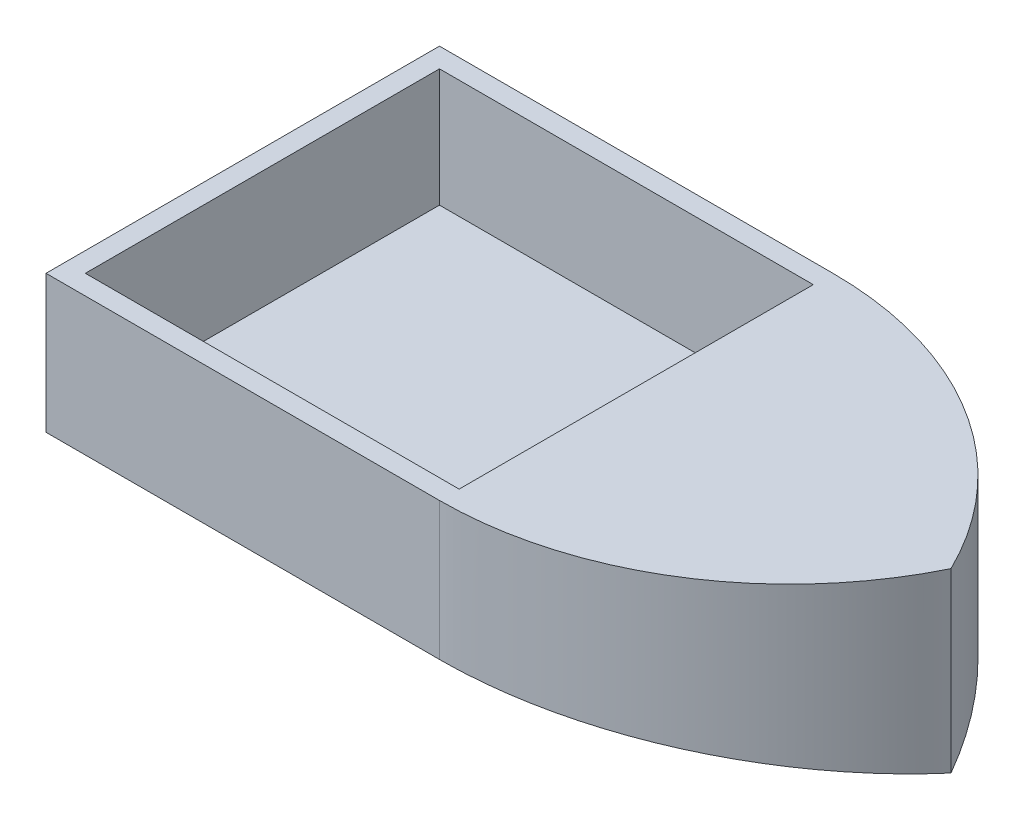
ISO-10303-21;
HEADER;
FILE_DESCRIPTION(('STEP AP214'),'2;1');
FILE_NAME('part.step','',(''),(''),'','','');
FILE_SCHEMA(('AUTOMOTIVE_DESIGN { 1 0 10303 214 1 1 1 1 }'));
ENDSEC;
DATA;
#1=APPLICATION_CONTEXT('core data for automotive mechanical design processes');
#2=APPLICATION_PROTOCOL_DEFINITION('international standard','automotive_design',2000,#1);
#3=PRODUCT_CONTEXT('',#1,'mechanical');
#4=PRODUCT('Part','Part','',(#3));
#5=PRODUCT_RELATED_PRODUCT_CATEGORY('part','',(#4));
#6=PRODUCT_DEFINITION_FORMATION('','',#4);
#7=PRODUCT_DEFINITION_CONTEXT('part definition',#1,'design');
#8=PRODUCT_DEFINITION('design','',#6,#7);
#9=PRODUCT_DEFINITION_SHAPE('','',#8);
#10=(LENGTH_UNIT() NAMED_UNIT(*) SI_UNIT(.MILLI.,.METRE.));
#11=(NAMED_UNIT(*) PLANE_ANGLE_UNIT() SI_UNIT($,.RADIAN.));
#12=(NAMED_UNIT(*) SI_UNIT($,.STERADIAN.) SOLID_ANGLE_UNIT());
#13=UNCERTAINTY_MEASURE_WITH_UNIT(LENGTH_MEASURE(1.E-05),#10,'distance_accuracy_value','');
#14=(GEOMETRIC_REPRESENTATION_CONTEXT(3) GLOBAL_UNCERTAINTY_ASSIGNED_CONTEXT((#13)) GLOBAL_UNIT_ASSIGNED_CONTEXT((#10,
#11,#12)) REPRESENTATION_CONTEXT('',''));
#15=CARTESIAN_POINT('',(0.,0.,0.));
#16=DIRECTION('',(0.,0.,1.));
#17=DIRECTION('',(1.,0.,0.));
#18=AXIS2_PLACEMENT_3D('',#15,#16,#17);
#19=CARTESIAN_POINT('',(0.,90.,-100.));
#20=DIRECTION('',(1.,0.,0.));
#21=DIRECTION('',(0.,0.,-1.));
#22=AXIS2_PLACEMENT_3D('',#19,#20,#21);
#23=PLANE('',#22);
#24=DIRECTION('',(0.,-1.,0.));
#25=VECTOR('',#24,1.);
#26=CARTESIAN_POINT('',(0.,90.,-100.));
#27=LINE('',#26,#25);
#28=CARTESIAN_POINT('',(0.,90.,-100.));
#29=VERTEX_POINT('',#28);
#30=CARTESIAN_POINT('',(0.,20.,-100.));
#31=VERTEX_POINT('',#30);
#32=EDGE_CURVE('E261',#29,#31,#27,.T.);
#33=ORIENTED_EDGE('',*,*,#32,.T.);
#34=DIRECTION('',(0.,0.196116135138184,-0.98058067569092));
#35=VECTOR('',#34,1.);
#36=CARTESIAN_POINT('',(0.,0.,0.));
#37=LINE('',#36,#35);
#38=CARTESIAN_POINT('',(0.,0.,0.));
#39=VERTEX_POINT('',#38);
#40=EDGE_CURVE('E224',#39,#31,#37,.T.);
#41=ORIENTED_EDGE('',*,*,#40,.F.);
#42=DIRECTION('',(0.,0.196116135138184,0.98058067569092));
#43=VECTOR('',#42,1.);
#44=CARTESIAN_POINT('',(0.,0.,0.));
#45=LINE('',#44,#43);
#46=CARTESIAN_POINT('',(0.,20.,100.));
#47=VERTEX_POINT('',#46);
#48=EDGE_CURVE('E229',#39,#47,#45,.T.);
#49=ORIENTED_EDGE('',*,*,#48,.T.);
#50=DIRECTION('',(0.,-1.,0.));
#51=VECTOR('',#50,1.);
#52=CARTESIAN_POINT('',(0.,90.,100.));
#53=LINE('',#52,#51);
#54=CARTESIAN_POINT('',(0.,90.,100.));
#55=VERTEX_POINT('',#54);
#56=EDGE_CURVE('E258',#55,#47,#53,.T.);
#57=ORIENTED_EDGE('',*,*,#56,.F.);
#58=DIRECTION('',(0.,0.,1.));
#59=VECTOR('',#58,1.);
#60=CARTESIAN_POINT('',(0.,90.,-100.));
#61=LINE('',#60,#59);
#62=EDGE_CURVE('E241',#29,#55,#61,.T.);
#63=ORIENTED_EDGE('',*,*,#62,.F.);
#64=EDGE_LOOP('',(#33,#41,#49,#57,#63));
#65=FACE_BOUND('',#64,.T.);
#66=ADVANCED_FACE('F39',(#65),#23,.F.);
#67=CARTESIAN_POINT('',(0.,90.,100.));
#68=DIRECTION('',(0.,0.,-1.));
#69=DIRECTION('',(-1.,0.,0.));
#70=AXIS2_PLACEMENT_3D('',#67,#68,#69);
#71=PLANE('',#70);
#72=DIRECTION('',(-1.,0.,0.));
#73=VECTOR('',#72,1.);
#74=CARTESIAN_POINT('',(360.,20.,99.9999999999999));
#75=LINE('',#74,#73);
#76=CARTESIAN_POINT('',(200.,20.,99.9999999999999));
#77=VERTEX_POINT('',#76);
#78=EDGE_CURVE('E233',#77,#47,#75,.T.);
#79=ORIENTED_EDGE('',*,*,#78,.F.);
#80=DIRECTION('',(0.,-1.,0.));
#81=VECTOR('',#80,1.);
#82=CARTESIAN_POINT('',(200.,90.,100.));
#83=LINE('',#82,#81);
#84=CARTESIAN_POINT('',(200.,90.,100.));
#85=VERTEX_POINT('',#84);
#86=EDGE_CURVE('E255',#85,#77,#83,.T.);
#87=ORIENTED_EDGE('',*,*,#86,.F.);
#88=DIRECTION('',(1.,0.,0.));
#89=VECTOR('',#88,1.);
#90=CARTESIAN_POINT('',(0.,90.,100.));
#91=LINE('',#90,#89);
#92=EDGE_CURVE('E243',#55,#85,#91,.T.);
#93=ORIENTED_EDGE('',*,*,#92,.F.);
#94=ORIENTED_EDGE('',*,*,#56,.T.);
#95=EDGE_LOOP('',(#79,#87,#93,#94));
#96=FACE_BOUND('',#95,.T.);
#97=ADVANCED_FACE('F325',(#96),#71,.F.);
#98=CARTESIAN_POINT('',(200.,90.,-77.9999999999999));
#99=DIRECTION('',(0.,-1.,0.));
#100=DIRECTION('',(0.,0.,-1.));
#101=AXIS2_PLACEMENT_3D('',#98,#99,#100);
#102=CYLINDRICAL_SURFACE('',#101,178.);
#103=CARTESIAN_POINT('',(200.,-15.6,-77.9999999999999));
#104=DIRECTION('',(0.,-0.98058067569092,0.196116135138184));
#105=DIRECTION('',(0.,-0.196116135138184,-0.98058067569092));
#106=AXIS2_PLACEMENT_3D('',#103,#104,#105);
#107=ELLIPSE('',#106,181.525094683903,178.);
#108=CARTESIAN_POINT('',(360.,0.,0.));
#109=VERTEX_POINT('',#108);
#110=EDGE_CURVE('E232',#109,#77,#107,.T.);
#111=ORIENTED_EDGE('',*,*,#110,.F.);
#112=DIRECTION('',(0.,-1.,0.));
#113=VECTOR('',#112,1.);
#114=CARTESIAN_POINT('',(360.,90.,0.));
#115=LINE('',#114,#113);
#116=CARTESIAN_POINT('',(360.,90.,0.));
#117=VERTEX_POINT('',#116);
#118=EDGE_CURVE('E252',#117,#109,#115,.T.);
#119=ORIENTED_EDGE('',*,*,#118,.F.);
#120=CARTESIAN_POINT('',(200.,90.,-77.9999999999999));
#121=DIRECTION('',(0.,1.,0.));
#122=DIRECTION('',(0.,0.,1.));
#123=AXIS2_PLACEMENT_3D('',#120,#121,#122);
#124=CIRCLE('',#123,178.);
#125=EDGE_CURVE('E245',#85,#117,#124,.T.);
#126=ORIENTED_EDGE('',*,*,#125,.F.);
#127=ORIENTED_EDGE('',*,*,#86,.T.);
#128=EDGE_LOOP('',(#111,#119,#126,#127));
#129=FACE_BOUND('',#128,.T.);
#130=ADVANCED_FACE('F330',(#129),#102,.T.);
#131=CARTESIAN_POINT('',(0.,90.,-100.));
#132=DIRECTION('',(0.,0.,1.));
#133=DIRECTION('',(1.,0.,0.));
#134=AXIS2_PLACEMENT_3D('',#131,#132,#133);
#135=PLANE('',#134);
#136=DIRECTION('',(0.,-1.,0.));
#137=VECTOR('',#136,1.);
#138=CARTESIAN_POINT('',(200.,90.,-100.));
#139=LINE('',#138,#137);
#140=CARTESIAN_POINT('',(200.,90.,-100.));
#141=VERTEX_POINT('',#140);
#142=CARTESIAN_POINT('',(200.,20.,-100.));
#143=VERTEX_POINT('',#142);
#144=EDGE_CURVE('E249',#141,#143,#139,.T.);
#145=ORIENTED_EDGE('',*,*,#144,.T.);
#146=DIRECTION('',(-1.,0.,0.));
#147=VECTOR('',#146,1.);
#148=CARTESIAN_POINT('',(360.,20.,-100.));
#149=LINE('',#148,#147);
#150=EDGE_CURVE('E218',#143,#31,#149,.T.);
#151=ORIENTED_EDGE('',*,*,#150,.T.);
#152=ORIENTED_EDGE('',*,*,#32,.F.);
#153=DIRECTION('',(-1.,0.,0.));
#154=VECTOR('',#153,1.);
#155=CARTESIAN_POINT('',(0.,90.,-100.));
#156=LINE('',#155,#154);
#157=EDGE_CURVE('E238',#141,#29,#156,.T.);
#158=ORIENTED_EDGE('',*,*,#157,.F.);
#159=EDGE_LOOP('',(#145,#151,#152,#158));
#160=FACE_BOUND('',#159,.T.);
#161=ADVANCED_FACE('F41',(#160),#135,.F.);
#162=CARTESIAN_POINT('',(200.,90.,77.9999999999999));
#163=DIRECTION('',(0.,-1.,0.));
#164=DIRECTION('',(0.,0.,-1.));
#165=AXIS2_PLACEMENT_3D('',#162,#163,#164);
#166=CYLINDRICAL_SURFACE('',#165,178.);
#167=ORIENTED_EDGE('',*,*,#118,.T.);
#168=CARTESIAN_POINT('',(200.,-15.6,77.9999999999999));
#169=DIRECTION('',(0.,0.98058067569092,0.196116135138184));
#170=DIRECTION('',(0.,-0.196116135138184,0.98058067569092));
#171=AXIS2_PLACEMENT_3D('',#168,#169,#170);
#172=ELLIPSE('',#171,181.525094683903,178.);
#173=EDGE_CURVE('E226',#109,#143,#172,.T.);
#174=ORIENTED_EDGE('',*,*,#173,.T.);
#175=ORIENTED_EDGE('',*,*,#144,.F.);
#176=CARTESIAN_POINT('',(200.,90.,77.9999999999999));
#177=DIRECTION('',(0.,1.,0.));
#178=DIRECTION('',(0.,0.,-1.));
#179=AXIS2_PLACEMENT_3D('',#176,#177,#178);
#180=CIRCLE('',#179,178.);
#181=EDGE_CURVE('E247',#117,#141,#180,.T.);
#182=ORIENTED_EDGE('',*,*,#181,.F.);
#183=EDGE_LOOP('',(#167,#174,#175,#182));
#184=FACE_BOUND('',#183,.T.);
#185=ADVANCED_FACE('F337',(#184),#166,.T.);
#186=CARTESIAN_POINT('',(200.,90.,77.9999999999999));
#187=DIRECTION('',(0.,-1.,0.));
#188=DIRECTION('',(0.,0.,-1.));
#189=AXIS2_PLACEMENT_3D('',#186,#187,#188);
#190=PLANE('',#189);
#191=DIRECTION('',(1.,0.,0.));
#192=VECTOR('',#191,1.);
#193=CARTESIAN_POINT('',(200.,90.,90.));
#194=LINE('',#193,#192);
#195=CARTESIAN_POINT('',(10.,90.,90.));
#196=VERTEX_POINT('',#195);
#197=CARTESIAN_POINT('',(200.,90.,90.));
#198=VERTEX_POINT('',#197);
#199=EDGE_CURVE('E172',#196,#198,#194,.T.);
#200=ORIENTED_EDGE('',*,*,#199,.F.);
#201=DIRECTION('',(0.,0.,1.));
#202=VECTOR('',#201,1.);
#203=CARTESIAN_POINT('',(10.,90.,90.));
#204=LINE('',#203,#202);
#205=CARTESIAN_POINT('',(9.99999999999999,90.,-90.));
#206=VERTEX_POINT('',#205);
#207=EDGE_CURVE('E55',#206,#196,#204,.T.);
#208=ORIENTED_EDGE('',*,*,#207,.F.);
#209=DIRECTION('',(-1.,0.,0.));
#210=VECTOR('',#209,1.);
#211=CARTESIAN_POINT('',(9.99999999999999,90.,-90.));
#212=LINE('',#211,#210);
#213=CARTESIAN_POINT('',(200.,90.,-90.));
#214=VERTEX_POINT('',#213);
#215=EDGE_CURVE('E154',#214,#206,#212,.T.);
#216=ORIENTED_EDGE('',*,*,#215,.F.);
#217=DIRECTION('',(0.,0.,-1.));
#218=VECTOR('',#217,1.);
#219=CARTESIAN_POINT('',(200.,90.,-90.));
#220=LINE('',#219,#218);
#221=EDGE_CURVE('E174',#198,#214,#220,.T.);
#222=ORIENTED_EDGE('',*,*,#221,.F.);
#223=EDGE_LOOP('',(#200,#208,#216,#222));
#224=FACE_BOUND('',#223,.T.);
#225=ORIENTED_EDGE('',*,*,#157,.T.);
#226=ORIENTED_EDGE('',*,*,#62,.T.);
#227=ORIENTED_EDGE('',*,*,#92,.T.);
#228=ORIENTED_EDGE('',*,*,#125,.T.);
#229=ORIENTED_EDGE('',*,*,#181,.T.);
#230=EDGE_LOOP('',(#225,#226,#227,#228,#229));
#231=FACE_BOUND('',#230,.T.);
#232=ADVANCED_FACE('F340',(#224,#231),#190,.F.);
#233=CARTESIAN_POINT('',(360.,0.,0.));
#234=DIRECTION('',(0.,-0.98058067569092,0.196116135138184));
#235=DIRECTION('',(0.,-0.196116135138184,-0.98058067569092));
#236=AXIS2_PLACEMENT_3D('',#233,#234,#235);
#237=PLANE('',#236);
#238=ORIENTED_EDGE('',*,*,#110,.T.);
#239=ORIENTED_EDGE('',*,*,#78,.T.);
#240=ORIENTED_EDGE('',*,*,#48,.F.);
#241=DIRECTION('',(-1.,0.,0.));
#242=VECTOR('',#241,1.);
#243=CARTESIAN_POINT('',(360.,0.,0.));
#244=LINE('',#243,#242);
#245=EDGE_CURVE('E230',#109,#39,#244,.T.);
#246=ORIENTED_EDGE('',*,*,#245,.F.);
#247=EDGE_LOOP('',(#238,#239,#240,#246));
#248=FACE_BOUND('',#247,.T.);
#249=ADVANCED_FACE('F344',(#248),#237,.T.);
#250=CARTESIAN_POINT('',(360.,0.,0.));
#251=DIRECTION('',(0.,0.98058067569092,0.196116135138184));
#252=DIRECTION('',(0.,-0.196116135138184,0.98058067569092));
#253=AXIS2_PLACEMENT_3D('',#250,#251,#252);
#254=PLANE('',#253);
#255=ORIENTED_EDGE('',*,*,#245,.T.);
#256=ORIENTED_EDGE('',*,*,#40,.T.);
#257=ORIENTED_EDGE('',*,*,#150,.F.);
#258=ORIENTED_EDGE('',*,*,#173,.F.);
#259=EDGE_LOOP('',(#255,#256,#257,#258));
#260=FACE_BOUND('',#259,.T.);
#261=ADVANCED_FACE('F312',(#260),#254,.F.);
#262=CARTESIAN_POINT('',(10.,60.,90.));
#263=DIRECTION('',(-1.,0.,0.));
#264=DIRECTION('',(0.,0.,1.));
#265=AXIS2_PLACEMENT_3D('',#262,#263,#264);
#266=PLANE('',#265);
#267=ORIENTED_EDGE('',*,*,#207,.T.);
#268=DIRECTION('',(0.,1.,0.));
#269=VECTOR('',#268,1.);
#270=CARTESIAN_POINT('',(10.,60.,90.));
#271=LINE('',#270,#269);
#272=CARTESIAN_POINT('',(10.,30.,90.));
#273=VERTEX_POINT('',#272);
#274=EDGE_CURVE('E144',#273,#196,#271,.T.);
#275=ORIENTED_EDGE('',*,*,#274,.F.);
#276=DIRECTION('',(0.,0.,1.));
#277=VECTOR('',#276,1.);
#278=CARTESIAN_POINT('',(10.,30.,90.));
#279=LINE('',#278,#277);
#280=CARTESIAN_POINT('',(9.99999999999999,30.,-90.));
#281=VERTEX_POINT('',#280);
#282=EDGE_CURVE('E148',#281,#273,#279,.T.);
#283=ORIENTED_EDGE('',*,*,#282,.F.);
#284=DIRECTION('',(0.,1.,0.));
#285=VECTOR('',#284,1.);
#286=CARTESIAN_POINT('',(9.99999999999999,60.,-90.));
#287=LINE('',#286,#285);
#288=EDGE_CURVE('E179',#281,#206,#287,.T.);
#289=ORIENTED_EDGE('',*,*,#288,.T.);
#290=EDGE_LOOP('',(#267,#275,#283,#289));
#291=FACE_BOUND('',#290,.T.);
#292=ADVANCED_FACE('F146',(#291),#266,.F.);
#293=CARTESIAN_POINT('',(9.99999999999999,60.,-90.));
#294=DIRECTION('',(0.,0.,-1.));
#295=DIRECTION('',(-1.,0.,0.));
#296=AXIS2_PLACEMENT_3D('',#293,#294,#295);
#297=PLANE('',#296);
#298=ORIENTED_EDGE('',*,*,#215,.T.);
#299=ORIENTED_EDGE('',*,*,#288,.F.);
#300=DIRECTION('',(-1.,0.,0.));
#301=VECTOR('',#300,1.);
#302=CARTESIAN_POINT('',(9.99999999999999,30.,-90.));
#303=LINE('',#302,#301);
#304=CARTESIAN_POINT('',(200.,30.,-90.));
#305=VERTEX_POINT('',#304);
#306=EDGE_CURVE('E166',#305,#281,#303,.T.);
#307=ORIENTED_EDGE('',*,*,#306,.F.);
#308=DIRECTION('',(0.,1.,0.));
#309=VECTOR('',#308,1.);
#310=CARTESIAN_POINT('',(200.,60.,-90.));
#311=LINE('',#310,#309);
#312=EDGE_CURVE('E182',#305,#214,#311,.T.);
#313=ORIENTED_EDGE('',*,*,#312,.T.);
#314=EDGE_LOOP('',(#298,#299,#307,#313));
#315=FACE_BOUND('',#314,.T.);
#316=ADVANCED_FACE('F311',(#315),#297,.F.);
#317=CARTESIAN_POINT('',(200.,60.,-90.));
#318=DIRECTION('',(1.,0.,0.));
#319=DIRECTION('',(0.,0.,-1.));
#320=AXIS2_PLACEMENT_3D('',#317,#318,#319);
#321=PLANE('',#320);
#322=ORIENTED_EDGE('',*,*,#221,.T.);
#323=ORIENTED_EDGE('',*,*,#312,.F.);
#324=DIRECTION('',(0.,0.,-1.));
#325=VECTOR('',#324,1.);
#326=CARTESIAN_POINT('',(200.,30.,-90.));
#327=LINE('',#326,#325);
#328=CARTESIAN_POINT('',(200.,30.,90.));
#329=VERTEX_POINT('',#328);
#330=EDGE_CURVE('E162',#329,#305,#327,.T.);
#331=ORIENTED_EDGE('',*,*,#330,.F.);
#332=DIRECTION('',(0.,1.,0.));
#333=VECTOR('',#332,1.);
#334=CARTESIAN_POINT('',(200.,60.,90.));
#335=LINE('',#334,#333);
#336=EDGE_CURVE('E153',#329,#198,#335,.T.);
#337=ORIENTED_EDGE('',*,*,#336,.T.);
#338=EDGE_LOOP('',(#322,#323,#331,#337));
#339=FACE_BOUND('',#338,.T.);
#340=ADVANCED_FACE('F315',(#339),#321,.F.);
#341=CARTESIAN_POINT('',(200.,60.,90.));
#342=DIRECTION('',(0.,0.,1.));
#343=DIRECTION('',(1.,0.,0.));
#344=AXIS2_PLACEMENT_3D('',#341,#342,#343);
#345=PLANE('',#344);
#346=ORIENTED_EDGE('',*,*,#199,.T.);
#347=ORIENTED_EDGE('',*,*,#336,.F.);
#348=DIRECTION('',(1.,0.,0.));
#349=VECTOR('',#348,1.);
#350=CARTESIAN_POINT('',(200.,30.,90.));
#351=LINE('',#350,#349);
#352=EDGE_CURVE('E157',#273,#329,#351,.T.);
#353=ORIENTED_EDGE('',*,*,#352,.F.);
#354=ORIENTED_EDGE('',*,*,#274,.T.);
#355=EDGE_LOOP('',(#346,#347,#353,#354));
#356=FACE_BOUND('',#355,.T.);
#357=ADVANCED_FACE('F158',(#356),#345,.F.);
#358=CARTESIAN_POINT('',(0.,30.,0.));
#359=DIRECTION('',(0.,-1.,0.));
#360=DIRECTION('',(0.,0.,-1.));
#361=AXIS2_PLACEMENT_3D('',#358,#359,#360);
#362=PLANE('',#361);
#363=ORIENTED_EDGE('',*,*,#282,.T.);
#364=ORIENTED_EDGE('',*,*,#352,.T.);
#365=ORIENTED_EDGE('',*,*,#330,.T.);
#366=ORIENTED_EDGE('',*,*,#306,.T.);
#367=EDGE_LOOP('',(#363,#364,#365,#366));
#368=FACE_BOUND('',#367,.T.);
#369=ADVANCED_FACE('F164',(#368),#362,.F.);
#370=CLOSED_SHELL('',(#66,#97,#130,#161,#185,#232,#249,#261,#292,#316,#340,#357,#369));
#371=CARTESIAN_POINT('',(200.,80.,77.9999999999996));
#372=DIRECTION('',(0.,1.,0.));
#373=DIRECTION('',(0.,0.,1.));
#374=AXIS2_PLACEMENT_3D('',#371,#372,#373);
#375=PLANE('',#374);
#376=DIRECTION('',(0.,0.,1.));
#377=VECTOR('',#376,1.);
#378=CARTESIAN_POINT('',(220.,80.,77.9999999999996));
#379=LINE('',#378,#377);
#380=CARTESIAN_POINT('',(220.,80.,-88.8052756959444));
#381=VERTEX_POINT('',#380);
#382=CARTESIAN_POINT('',(220.,80.,88.8052756959437));
#383=VERTEX_POINT('',#382);
#384=EDGE_CURVE('E48',#381,#383,#379,.T.);
#385=ORIENTED_EDGE('',*,*,#384,.F.);
#386=CARTESIAN_POINT('',(200.,80.,77.9999999999996));
#387=DIRECTION('',(0.,1.,0.));
#388=DIRECTION('',(0.,0.,1.));
#389=AXIS2_PLACEMENT_3D('',#386,#387,#388);
#390=CIRCLE('',#389,168.);
#391=CARTESIAN_POINT('',(348.795161211647,80.,0.));
#392=VERTEX_POINT('',#391);
#393=EDGE_CURVE('E201',#392,#381,#390,.T.);
#394=ORIENTED_EDGE('',*,*,#393,.F.);
#395=CARTESIAN_POINT('',(199.999999999994,80.,-78.0000000000102));
#396=DIRECTION('',(0.,1.,0.));
#397=DIRECTION('',(0.,0.,1.));
#398=AXIS2_PLACEMENT_3D('',#395,#396,#397);
#399=CIRCLE('',#398,168.00000000001);
#400=EDGE_CURVE('E204',#383,#392,#399,.T.);
#401=ORIENTED_EDGE('',*,*,#400,.F.);
#402=EDGE_LOOP('',(#385,#394,#401));
#403=FACE_BOUND('',#402,.T.);
#404=ADVANCED_FACE('F271',(#403),#375,.F.);
#405=CARTESIAN_POINT('',(200.,90.,77.9999999999999));
#406=DIRECTION('',(0.,-1.,0.));
#407=DIRECTION('',(0.,0.,-1.));
#408=AXIS2_PLACEMENT_3D('',#405,#406,#407);
#409=CYLINDRICAL_SURFACE('',#408,168.);
#410=ORIENTED_EDGE('',*,*,#393,.T.);
#411=DIRECTION('',(0.,-1.,0.));
#412=VECTOR('',#411,1.);
#413=CARTESIAN_POINT('',(220.,90.,-88.8052756959443));
#414=LINE('',#413,#412);
#415=CARTESIAN_POINT('',(220.,27.9590941663744,-88.8052756959444));
#416=VERTEX_POINT('',#415);
#417=EDGE_CURVE('E193',#381,#416,#414,.T.);
#418=ORIENTED_EDGE('',*,*,#417,.T.);
#419=CARTESIAN_POINT('',(200.,-5.40196097281441,77.9999999999999));
#420=DIRECTION('',(0.,0.98058067569092,0.196116135138184));
#421=DIRECTION('',(0.,-0.196116135138184,0.98058067569092));
#422=AXIS2_PLACEMENT_3D('',#419,#420,#421);
#423=ELLIPSE('',#422,171.327055656718,168.);
#424=CARTESIAN_POINT('',(348.795161211647,10.1980390271856,0.));
#425=VERTEX_POINT('',#424);
#426=EDGE_CURVE('E209',#425,#416,#423,.T.);
#427=ORIENTED_EDGE('',*,*,#426,.F.);
#428=DIRECTION('',(0.,-1.,0.));
#429=VECTOR('',#428,1.);
#430=CARTESIAN_POINT('',(348.795161211647,90.,0.));
#431=LINE('',#430,#429);
#432=EDGE_CURVE('E216',#392,#425,#431,.T.);
#433=ORIENTED_EDGE('',*,*,#432,.F.);
#434=EDGE_LOOP('',(#410,#418,#427,#433));
#435=FACE_BOUND('',#434,.T.);
#436=ADVANCED_FACE('F274',(#435),#409,.F.);
#437=CARTESIAN_POINT('',(200.,90.,-77.9999999999999));
#438=DIRECTION('',(0.,-1.,0.));
#439=DIRECTION('',(0.,0.,-1.));
#440=AXIS2_PLACEMENT_3D('',#437,#438,#439);
#441=CYLINDRICAL_SURFACE('',#440,168.);
#442=CARTESIAN_POINT('',(200.,-5.4019609728144,-77.9999999999999));
#443=DIRECTION('',(0.,-0.98058067569092,0.196116135138184));
#444=DIRECTION('',(0.,-0.196116135138184,-0.98058067569092));
#445=AXIS2_PLACEMENT_3D('',#442,#443,#444);
#446=ELLIPSE('',#445,171.327055656717,168.);
#447=CARTESIAN_POINT('',(220.,27.9590941663744,88.8052756959443));
#448=VERTEX_POINT('',#447);
#449=EDGE_CURVE('E213',#425,#448,#446,.T.);
#450=ORIENTED_EDGE('',*,*,#449,.T.);
#451=DIRECTION('',(0.,-1.,0.));
#452=VECTOR('',#451,1.);
#453=CARTESIAN_POINT('',(220.,90.,88.8052756959443));
#454=LINE('',#453,#452);
#455=EDGE_CURVE('E197',#448,#383,#454,.F.);
#456=ORIENTED_EDGE('',*,*,#455,.T.);
#457=ORIENTED_EDGE('',*,*,#400,.T.);
#458=ORIENTED_EDGE('',*,*,#432,.T.);
#459=EDGE_LOOP('',(#450,#456,#457,#458));
#460=FACE_BOUND('',#459,.T.);
#461=ADVANCED_FACE('F278',(#460),#441,.F.);
#462=CARTESIAN_POINT('',(220.,0.,0.));
#463=DIRECTION('',(-1.,0.,0.));
#464=DIRECTION('',(0.,0.,1.));
#465=AXIS2_PLACEMENT_3D('',#462,#463,#464);
#466=PLANE('',#465);
#467=ORIENTED_EDGE('',*,*,#455,.F.);
#468=DIRECTION('',(0.,-0.196116135138184,-0.98058067569092));
#469=VECTOR('',#468,1.);
#470=CARTESIAN_POINT('',(220.,9.8058067569092,-1.96116135138188));
#471=LINE('',#470,#469);
#472=CARTESIAN_POINT('',(220.,20.,49.0098048640721));
#473=VERTEX_POINT('',#472);
#474=EDGE_CURVE('E195',#448,#473,#471,.T.);
#475=ORIENTED_EDGE('',*,*,#474,.T.);
#476=DIRECTION('',(0.,0.,1.));
#477=VECTOR('',#476,1.);
#478=CARTESIAN_POINT('',(220.,20.,0.));
#479=LINE('',#478,#477);
#480=CARTESIAN_POINT('',(220.,20.,-49.0098048640722));
#481=VERTEX_POINT('',#480);
#482=EDGE_CURVE('E187',#481,#473,#479,.T.);
#483=ORIENTED_EDGE('',*,*,#482,.F.);
#484=DIRECTION('',(0.,-0.196116135138184,0.98058067569092));
#485=VECTOR('',#484,1.);
#486=CARTESIAN_POINT('',(220.,9.8058067569092,1.9611613513818));
#487=LINE('',#486,#485);
#488=EDGE_CURVE('E190',#416,#481,#487,.T.);
#489=ORIENTED_EDGE('',*,*,#488,.F.);
#490=ORIENTED_EDGE('',*,*,#417,.F.);
#491=ORIENTED_EDGE('',*,*,#384,.T.);
#492=EDGE_LOOP('',(#467,#475,#483,#489,#490,#491));
#493=FACE_BOUND('',#492,.T.);
#494=ADVANCED_FACE('F267',(#493),#466,.F.);
#495=CARTESIAN_POINT('',(360.,9.8058067569092,-1.9611613513819));
#496=DIRECTION('',(0.,-0.98058067569092,0.196116135138184));
#497=DIRECTION('',(0.,-0.196116135138184,-0.98058067569092));
#498=AXIS2_PLACEMENT_3D('',#495,#496,#497);
#499=PLANE('',#498);
#500=DIRECTION('',(0.,0.196116135138184,0.98058067569092));
#501=VECTOR('',#500,1.);
#502=CARTESIAN_POINT('',(10.,9.8058067569092,-1.96116135138184));
#503=LINE('',#502,#501);
#504=CARTESIAN_POINT('',(10.,10.1980390271856,0.));
#505=VERTEX_POINT('',#504);
#506=CARTESIAN_POINT('',(10.,20.,49.0098048640721));
#507=VERTEX_POINT('',#506);
#508=EDGE_CURVE('E210',#505,#507,#503,.T.);
#509=ORIENTED_EDGE('',*,*,#508,.T.);
#510=DIRECTION('',(1.,0.,0.));
#511=VECTOR('',#510,1.);
#512=CARTESIAN_POINT('',(360.,20.,49.0098048640721));
#513=LINE('',#512,#511);
#514=EDGE_CURVE('E63',#507,#473,#513,.T.);
#515=ORIENTED_EDGE('',*,*,#514,.T.);
#516=ORIENTED_EDGE('',*,*,#474,.F.);
#517=ORIENTED_EDGE('',*,*,#449,.F.);
#518=DIRECTION('',(-1.,0.,0.));
#519=VECTOR('',#518,1.);
#520=CARTESIAN_POINT('',(360.,10.1980390271856,0.));
#521=LINE('',#520,#519);
#522=EDGE_CURVE('E212',#425,#505,#521,.T.);
#523=ORIENTED_EDGE('',*,*,#522,.T.);
#524=EDGE_LOOP('',(#509,#515,#516,#517,#523));
#525=FACE_BOUND('',#524,.T.);
#526=ADVANCED_FACE('F280',(#525),#499,.F.);
#527=CARTESIAN_POINT('',(360.,9.8058067569092,1.96116135138178));
#528=DIRECTION('',(0.,0.98058067569092,0.196116135138184));
#529=DIRECTION('',(0.,-0.196116135138184,0.98058067569092));
#530=AXIS2_PLACEMENT_3D('',#527,#528,#529);
#531=PLANE('',#530);
#532=DIRECTION('',(1.,0.,0.));
#533=VECTOR('',#532,1.);
#534=CARTESIAN_POINT('',(360.,20.,-49.0098048640723));
#535=LINE('',#534,#533);
#536=CARTESIAN_POINT('',(10.,20.,-49.0098048640721));
#537=VERTEX_POINT('',#536);
#538=EDGE_CURVE('E11',#537,#481,#535,.T.);
#539=ORIENTED_EDGE('',*,*,#538,.F.);
#540=DIRECTION('',(0.,0.196116135138184,-0.98058067569092));
#541=VECTOR('',#540,1.);
#542=CARTESIAN_POINT('',(10.,9.8058067569092,1.96116135138184));
#543=LINE('',#542,#541);
#544=EDGE_CURVE('E206',#505,#537,#543,.T.);
#545=ORIENTED_EDGE('',*,*,#544,.F.);
#546=ORIENTED_EDGE('',*,*,#522,.F.);
#547=ORIENTED_EDGE('',*,*,#426,.T.);
#548=ORIENTED_EDGE('',*,*,#488,.T.);
#549=EDGE_LOOP('',(#539,#545,#546,#547,#548));
#550=FACE_BOUND('',#549,.T.);
#551=ADVANCED_FACE('F287',(#550),#531,.T.);
#552=CARTESIAN_POINT('',(220.,20.,0.));
#553=DIRECTION('',(0.,-1.,0.));
#554=DIRECTION('',(0.,0.,-1.));
#555=AXIS2_PLACEMENT_3D('',#552,#553,#554);
#556=PLANE('',#555);
#557=ORIENTED_EDGE('',*,*,#482,.T.);
#558=ORIENTED_EDGE('',*,*,#514,.F.);
#559=DIRECTION('',(0.,0.,1.));
#560=VECTOR('',#559,1.);
#561=CARTESIAN_POINT('',(10.,20.,90.));
#562=LINE('',#561,#560);
#563=EDGE_CURVE('E181',#537,#507,#562,.T.);
#564=ORIENTED_EDGE('',*,*,#563,.F.);
#565=ORIENTED_EDGE('',*,*,#538,.T.);
#566=EDGE_LOOP('',(#557,#558,#564,#565));
#567=FACE_BOUND('',#566,.T.);
#568=ADVANCED_FACE('F284',(#567),#556,.T.);
#569=CARTESIAN_POINT('',(9.99999999999999,90.,-100.));
#570=DIRECTION('',(1.,0.,0.));
#571=DIRECTION('',(0.,0.,-1.));
#572=AXIS2_PLACEMENT_3D('',#569,#570,#571);
#573=PLANE('',#572);
#574=ORIENTED_EDGE('',*,*,#563,.T.);
#575=ORIENTED_EDGE('',*,*,#508,.F.);
#576=ORIENTED_EDGE('',*,*,#544,.T.);
#577=EDGE_LOOP('',(#574,#575,#576));
#578=FACE_BOUND('',#577,.T.);
#579=ADVANCED_FACE('F290',(#578),#573,.T.);
#580=CLOSED_SHELL('',(#404,#436,#461,#494,#526,#551,#568,#579));
#581=ORIENTED_CLOSED_SHELL('',*,#580,.T.);
#582=BREP_WITH_VOIDS('B2',#370,(#581));
#583=ADVANCED_BREP_SHAPE_REPRESENTATION('',(#18,#582),#14);
#584=SHAPE_DEFINITION_REPRESENTATION(#9,#583);
ENDSEC;
END-ISO-10303-21;
